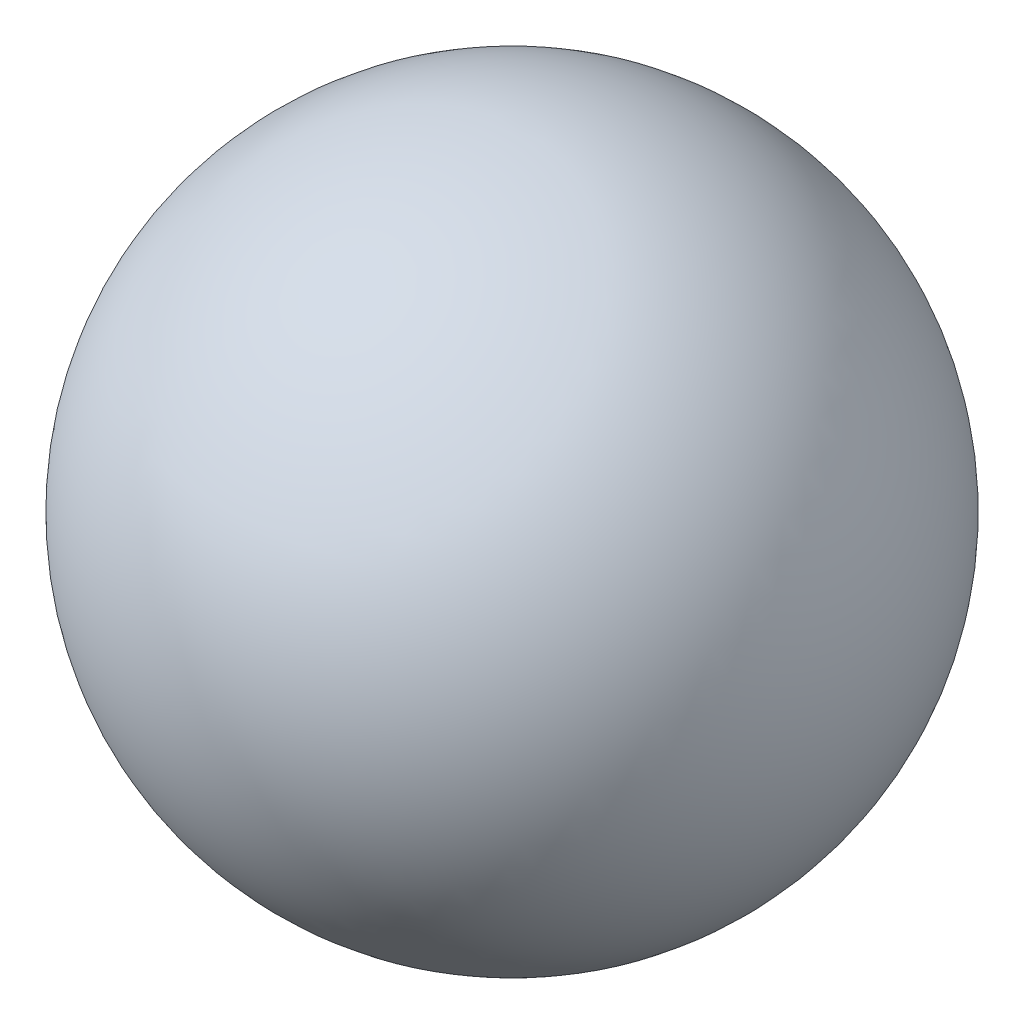
ISO-10303-21;
HEADER;
FILE_DESCRIPTION(('STEP AP214'),'2;1');
FILE_NAME('part.step','',(''),(''),'','','');
FILE_SCHEMA(('AUTOMOTIVE_DESIGN { 1 0 10303 214 1 1 1 1 }'));
ENDSEC;
DATA;
#1=APPLICATION_CONTEXT('core data for automotive mechanical design processes');
#2=APPLICATION_PROTOCOL_DEFINITION('international standard','automotive_design',2000,#1);
#3=PRODUCT_CONTEXT('',#1,'mechanical');
#4=PRODUCT('Part','Part','',(#3));
#5=PRODUCT_RELATED_PRODUCT_CATEGORY('part','',(#4));
#6=PRODUCT_DEFINITION_FORMATION('','',#4);
#7=PRODUCT_DEFINITION_CONTEXT('part definition',#1,'design');
#8=PRODUCT_DEFINITION('design','',#6,#7);
#9=PRODUCT_DEFINITION_SHAPE('','',#8);
#10=(LENGTH_UNIT() NAMED_UNIT(*) SI_UNIT(.MILLI.,.METRE.));
#11=(NAMED_UNIT(*) PLANE_ANGLE_UNIT() SI_UNIT($,.RADIAN.));
#12=(NAMED_UNIT(*) SI_UNIT($,.STERADIAN.) SOLID_ANGLE_UNIT());
#13=UNCERTAINTY_MEASURE_WITH_UNIT(LENGTH_MEASURE(1.E-05),#10,'distance_accuracy_value','');
#14=(GEOMETRIC_REPRESENTATION_CONTEXT(3) GLOBAL_UNCERTAINTY_ASSIGNED_CONTEXT((#13)) GLOBAL_UNIT_ASSIGNED_CONTEXT((#10,
#11,#12)) REPRESENTATION_CONTEXT('',''));
#15=CARTESIAN_POINT('',(0.,0.,0.));
#16=DIRECTION('',(0.,0.,1.));
#17=DIRECTION('',(1.,0.,0.));
#18=AXIS2_PLACEMENT_3D('',#15,#16,#17);
#19=CARTESIAN_POINT('',(0.,0.,0.));
#20=DIRECTION('',(0.,1.,0.));
#21=DIRECTION('',(1.,0.,0.));
#22=AXIS2_PLACEMENT_3D('',#19,#20,#21);
#23=SPHERICAL_SURFACE('',#22,32.5);
#24=CARTESIAN_POINT('',(0.,32.5,0.));
#25=VERTEX_POINT('',#24);
#26=VERTEX_LOOP('',#25);
#27=FACE_BOUND('',#26,.T.);
#28=ADVANCED_FACE('F31',(#27),#23,.T.);
#29=CLOSED_SHELL('',(#28));
#30=MANIFOLD_SOLID_BREP('B2',#29);
#31=ADVANCED_BREP_SHAPE_REPRESENTATION('',(#18,#30),#14);
#32=SHAPE_DEFINITION_REPRESENTATION(#9,#31);
ENDSEC;
END-ISO-10303-21;
